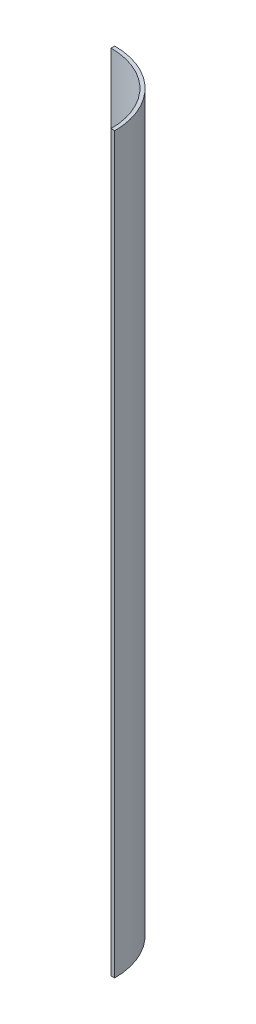
ISO-10303-21;
HEADER;
FILE_DESCRIPTION(('STEP AP214'),'2;1');
FILE_NAME('part.step','',(''),(''),'','','');
FILE_SCHEMA(('AUTOMOTIVE_DESIGN { 1 0 10303 214 1 1 1 1 }'));
ENDSEC;
DATA;
#1=APPLICATION_CONTEXT('core data for automotive mechanical design processes');
#2=APPLICATION_PROTOCOL_DEFINITION('international standard','automotive_design',2000,#1);
#3=PRODUCT_CONTEXT('',#1,'mechanical');
#4=PRODUCT('Part','Part','',(#3));
#5=PRODUCT_RELATED_PRODUCT_CATEGORY('part','',(#4));
#6=PRODUCT_DEFINITION_FORMATION('','',#4);
#7=PRODUCT_DEFINITION_CONTEXT('part definition',#1,'design');
#8=PRODUCT_DEFINITION('design','',#6,#7);
#9=PRODUCT_DEFINITION_SHAPE('','',#8);
#10=(LENGTH_UNIT() NAMED_UNIT(*) SI_UNIT(.MILLI.,.METRE.));
#11=(NAMED_UNIT(*) PLANE_ANGLE_UNIT() SI_UNIT($,.RADIAN.));
#12=(NAMED_UNIT(*) SI_UNIT($,.STERADIAN.) SOLID_ANGLE_UNIT());
#13=UNCERTAINTY_MEASURE_WITH_UNIT(LENGTH_MEASURE(1.E-05),#10,'distance_accuracy_value','');
#14=(GEOMETRIC_REPRESENTATION_CONTEXT(3) GLOBAL_UNCERTAINTY_ASSIGNED_CONTEXT((#13)) GLOBAL_UNIT_ASSIGNED_CONTEXT((#10,
#11,#12)) REPRESENTATION_CONTEXT('',''));
#15=CARTESIAN_POINT('',(0.,0.,0.));
#16=DIRECTION('',(0.,0.,1.));
#17=DIRECTION('',(1.,0.,0.));
#18=AXIS2_PLACEMENT_3D('',#15,#16,#17);
#19=CARTESIAN_POINT('',(0.,254.,0.));
#20=DIRECTION('',(0.,-1.,0.));
#21=DIRECTION('',(0.,0.,-1.));
#22=AXIS2_PLACEMENT_3D('',#19,#20,#21);
#23=CYLINDRICAL_SURFACE('',#22,25.4);
#24=CARTESIAN_POINT('',(0.,0.,0.));
#25=DIRECTION('',(0.,1.,0.));
#26=DIRECTION('',(0.,0.,-1.));
#27=AXIS2_PLACEMENT_3D('',#24,#25,#26);
#28=CIRCLE('',#27,25.4);
#29=CARTESIAN_POINT('',(25.4,0.,0.));
#30=VERTEX_POINT('',#29);
#31=CARTESIAN_POINT('',(0.,0.,-25.4));
#32=VERTEX_POINT('',#31);
#33=EDGE_CURVE('E96',#30,#32,#28,.T.);
#34=ORIENTED_EDGE('',*,*,#33,.T.);
#35=DIRECTION('',(0.,-1.,0.));
#36=VECTOR('',#35,1.);
#37=CARTESIAN_POINT('',(0.,254.,-25.4));
#38=LINE('',#37,#36);
#39=CARTESIAN_POINT('',(0.,254.,-25.4));
#40=VERTEX_POINT('',#39);
#41=EDGE_CURVE('E11',#40,#32,#38,.T.);
#42=ORIENTED_EDGE('',*,*,#41,.F.);
#43=CARTESIAN_POINT('',(0.,254.,0.));
#44=DIRECTION('',(0.,1.,0.));
#45=DIRECTION('',(0.,0.,-1.));
#46=AXIS2_PLACEMENT_3D('',#43,#44,#45);
#47=CIRCLE('',#46,25.4);
#48=CARTESIAN_POINT('',(25.4,254.,0.));
#49=VERTEX_POINT('',#48);
#50=EDGE_CURVE('E84',#49,#40,#47,.T.);
#51=ORIENTED_EDGE('',*,*,#50,.F.);
#52=DIRECTION('',(0.,-1.,0.));
#53=VECTOR('',#52,1.);
#54=CARTESIAN_POINT('',(25.4,254.,0.));
#55=LINE('',#54,#53);
#56=EDGE_CURVE('E92',#49,#30,#55,.T.);
#57=ORIENTED_EDGE('',*,*,#56,.T.);
#58=EDGE_LOOP('',(#34,#42,#51,#57));
#59=FACE_BOUND('',#58,.T.);
#60=ADVANCED_FACE('F33',(#59),#23,.T.);
#61=CARTESIAN_POINT('',(0.,254.,-24.13));
#62=DIRECTION('',(1.,0.,0.));
#63=DIRECTION('',(0.,0.,-1.));
#64=AXIS2_PLACEMENT_3D('',#61,#62,#63);
#65=PLANE('',#64);
#66=DIRECTION('',(0.,0.,1.));
#67=VECTOR('',#66,1.);
#68=CARTESIAN_POINT('',(0.,0.,-24.13));
#69=LINE('',#68,#67);
#70=CARTESIAN_POINT('',(0.,0.,-24.13));
#71=VERTEX_POINT('',#70);
#72=EDGE_CURVE('E88',#32,#71,#69,.T.);
#73=ORIENTED_EDGE('',*,*,#72,.T.);
#74=DIRECTION('',(0.,-1.,0.));
#75=VECTOR('',#74,1.);
#76=CARTESIAN_POINT('',(0.,254.,-24.13));
#77=LINE('',#76,#75);
#78=CARTESIAN_POINT('',(0.,254.,-24.13));
#79=VERTEX_POINT('',#78);
#80=EDGE_CURVE('E41',#79,#71,#77,.T.);
#81=ORIENTED_EDGE('',*,*,#80,.F.);
#82=DIRECTION('',(0.,0.,1.));
#83=VECTOR('',#82,1.);
#84=CARTESIAN_POINT('',(0.,254.,-24.13));
#85=LINE('',#84,#83);
#86=EDGE_CURVE('E79',#40,#79,#85,.T.);
#87=ORIENTED_EDGE('',*,*,#86,.F.);
#88=ORIENTED_EDGE('',*,*,#41,.T.);
#89=EDGE_LOOP('',(#73,#81,#87,#88));
#90=FACE_BOUND('',#89,.T.);
#91=ADVANCED_FACE('F87',(#90),#65,.F.);
#92=CARTESIAN_POINT('',(0.,254.,0.));
#93=DIRECTION('',(0.,-1.,0.));
#94=DIRECTION('',(0.,0.,-1.));
#95=AXIS2_PLACEMENT_3D('',#92,#93,#94);
#96=CYLINDRICAL_SURFACE('',#95,24.13);
#97=CARTESIAN_POINT('',(0.,0.,0.));
#98=DIRECTION('',(0.,-1.,0.));
#99=DIRECTION('',(0.,0.,-1.));
#100=AXIS2_PLACEMENT_3D('',#97,#98,#99);
#101=CIRCLE('',#100,24.13);
#102=CARTESIAN_POINT('',(24.13,0.,0.));
#103=VERTEX_POINT('',#102);
#104=EDGE_CURVE('E66',#71,#103,#101,.T.);
#105=ORIENTED_EDGE('',*,*,#104,.T.);
#106=DIRECTION('',(0.,-1.,0.));
#107=VECTOR('',#106,1.);
#108=CARTESIAN_POINT('',(24.13,254.,0.));
#109=LINE('',#108,#107);
#110=CARTESIAN_POINT('',(24.13,254.,0.));
#111=VERTEX_POINT('',#110);
#112=EDGE_CURVE('E89',#111,#103,#109,.T.);
#113=ORIENTED_EDGE('',*,*,#112,.F.);
#114=CARTESIAN_POINT('',(0.,254.,0.));
#115=DIRECTION('',(0.,-1.,0.));
#116=DIRECTION('',(0.,0.,-1.));
#117=AXIS2_PLACEMENT_3D('',#114,#115,#116);
#118=CIRCLE('',#117,24.13);
#119=EDGE_CURVE('E82',#79,#111,#118,.T.);
#120=ORIENTED_EDGE('',*,*,#119,.F.);
#121=ORIENTED_EDGE('',*,*,#80,.T.);
#122=EDGE_LOOP('',(#105,#113,#120,#121));
#123=FACE_BOUND('',#122,.T.);
#124=ADVANCED_FACE('F90',(#123),#96,.F.);
#125=CARTESIAN_POINT('',(24.13,254.,0.));
#126=DIRECTION('',(0.,0.,-1.));
#127=DIRECTION('',(-1.,0.,0.));
#128=AXIS2_PLACEMENT_3D('',#125,#126,#127);
#129=PLANE('',#128);
#130=DIRECTION('',(1.,0.,0.));
#131=VECTOR('',#130,1.);
#132=CARTESIAN_POINT('',(24.13,0.,0.));
#133=LINE('',#132,#131);
#134=EDGE_CURVE('E72',#103,#30,#133,.T.);
#135=ORIENTED_EDGE('',*,*,#134,.T.);
#136=ORIENTED_EDGE('',*,*,#56,.F.);
#137=DIRECTION('',(1.,0.,0.));
#138=VECTOR('',#137,1.);
#139=CARTESIAN_POINT('',(24.13,254.,0.));
#140=LINE('',#139,#138);
#141=EDGE_CURVE('E49',#111,#49,#140,.T.);
#142=ORIENTED_EDGE('',*,*,#141,.F.);
#143=ORIENTED_EDGE('',*,*,#112,.T.);
#144=EDGE_LOOP('',(#135,#136,#142,#143));
#145=FACE_BOUND('',#144,.T.);
#146=ADVANCED_FACE('F103',(#145),#129,.F.);
#147=CARTESIAN_POINT('',(0.,254.,0.));
#148=DIRECTION('',(0.,-1.,0.));
#149=DIRECTION('',(0.,0.,-1.));
#150=AXIS2_PLACEMENT_3D('',#147,#148,#149);
#151=PLANE('',#150);
#152=ORIENTED_EDGE('',*,*,#50,.T.);
#153=ORIENTED_EDGE('',*,*,#86,.T.);
#154=ORIENTED_EDGE('',*,*,#119,.T.);
#155=ORIENTED_EDGE('',*,*,#141,.T.);
#156=EDGE_LOOP('',(#152,#153,#154,#155));
#157=FACE_BOUND('',#156,.T.);
#158=ADVANCED_FACE('F80',(#157),#151,.F.);
#159=CARTESIAN_POINT('',(0.,0.,0.));
#160=DIRECTION('',(0.,-1.,0.));
#161=DIRECTION('',(0.,0.,-1.));
#162=AXIS2_PLACEMENT_3D('',#159,#160,#161);
#163=PLANE('',#162);
#164=ORIENTED_EDGE('',*,*,#33,.F.);
#165=ORIENTED_EDGE('',*,*,#134,.F.);
#166=ORIENTED_EDGE('',*,*,#104,.F.);
#167=ORIENTED_EDGE('',*,*,#72,.F.);
#168=EDGE_LOOP('',(#164,#165,#166,#167));
#169=FACE_BOUND('',#168,.T.);
#170=ADVANCED_FACE('F106',(#169),#163,.T.);
#171=CLOSED_SHELL('',(#60,#91,#124,#146,#158,#170));
#172=MANIFOLD_SOLID_BREP('B2',#171);
#173=ADVANCED_BREP_SHAPE_REPRESENTATION('',(#18,#172),#14);
#174=SHAPE_DEFINITION_REPRESENTATION(#9,#173);
ENDSEC;
END-ISO-10303-21;
